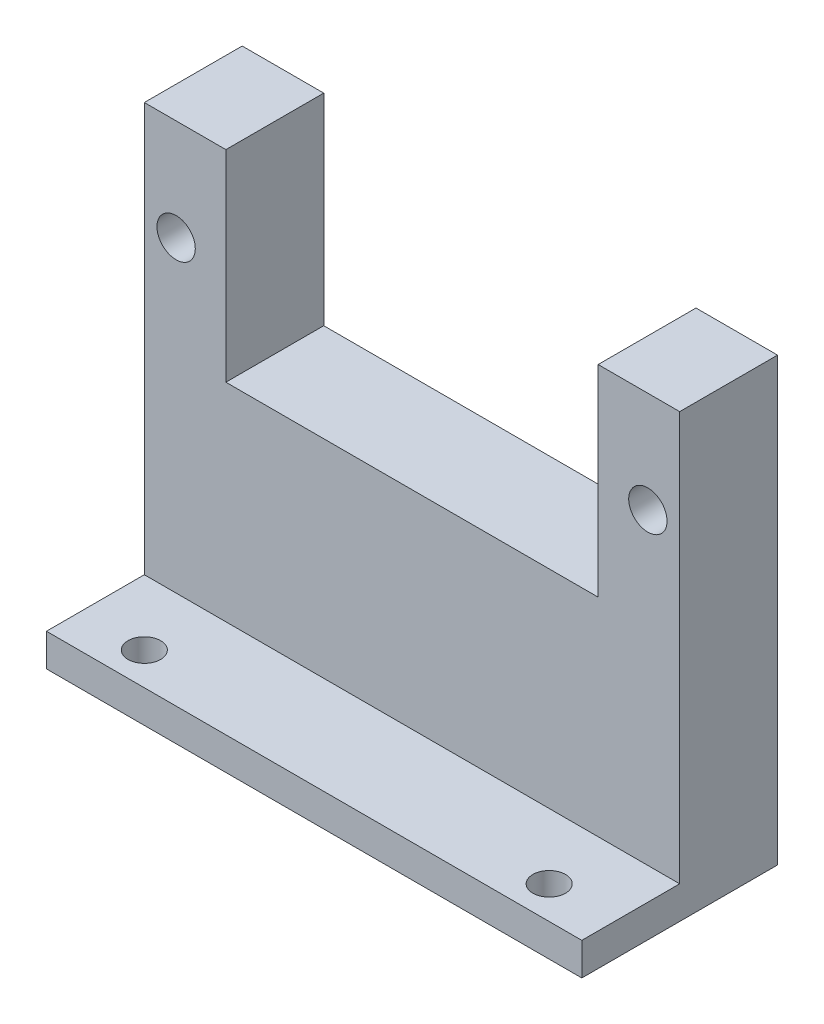
ISO-10303-21;
HEADER;
FILE_DESCRIPTION(('STEP AP214'),'2;1');
FILE_NAME('part.step','',(''),(''),'','','');
FILE_SCHEMA(('AUTOMOTIVE_DESIGN { 1 0 10303 214 1 1 1 1 }'));
ENDSEC;
DATA;
#1=APPLICATION_CONTEXT('core data for automotive mechanical design processes');
#2=APPLICATION_PROTOCOL_DEFINITION('international standard','automotive_design',2000,#1);
#3=PRODUCT_CONTEXT('',#1,'mechanical');
#4=PRODUCT('Part','Part','',(#3));
#5=PRODUCT_RELATED_PRODUCT_CATEGORY('part','',(#4));
#6=PRODUCT_DEFINITION_FORMATION('','',#4);
#7=PRODUCT_DEFINITION_CONTEXT('part definition',#1,'design');
#8=PRODUCT_DEFINITION('design','',#6,#7);
#9=PRODUCT_DEFINITION_SHAPE('','',#8);
#10=(LENGTH_UNIT() NAMED_UNIT(*) SI_UNIT(.MILLI.,.METRE.));
#11=(NAMED_UNIT(*) PLANE_ANGLE_UNIT() SI_UNIT($,.RADIAN.));
#12=(NAMED_UNIT(*) SI_UNIT($,.STERADIAN.) SOLID_ANGLE_UNIT());
#13=UNCERTAINTY_MEASURE_WITH_UNIT(LENGTH_MEASURE(1.E-05),#10,'distance_accuracy_value','');
#14=(GEOMETRIC_REPRESENTATION_CONTEXT(3) GLOBAL_UNCERTAINTY_ASSIGNED_CONTEXT((#13)) GLOBAL_UNIT_ASSIGNED_CONTEXT((#10,
#11,#12)) REPRESENTATION_CONTEXT('',''));
#15=CARTESIAN_POINT('',(0.,0.,0.));
#16=DIRECTION('',(0.,0.,1.));
#17=DIRECTION('',(1.,0.,0.));
#18=AXIS2_PLACEMENT_3D('',#15,#16,#17);
#19=CARTESIAN_POINT('',(0.,27.07,12.));
#20=DIRECTION('',(0.,1.,0.));
#21=DIRECTION('',(0.,0.,1.));
#22=AXIS2_PLACEMENT_3D('',#19,#20,#21);
#23=PLANE('',#22);
#24=DIRECTION('',(0.,0.,-1.));
#25=VECTOR('',#24,1.);
#26=CARTESIAN_POINT('',(5.,27.07,12.));
#27=LINE('',#26,#25);
#28=CARTESIAN_POINT('',(5.,27.07,6.));
#29=VERTEX_POINT('',#28);
#30=CARTESIAN_POINT('',(5.,27.07,0.));
#31=VERTEX_POINT('',#30);
#32=EDGE_CURVE('E116',#29,#31,#27,.T.);
#33=ORIENTED_EDGE('',*,*,#32,.T.);
#34=DIRECTION('',(1.,0.,0.));
#35=VECTOR('',#34,1.);
#36=CARTESIAN_POINT('',(0.,27.07,0.));
#37=LINE('',#36,#35);
#38=CARTESIAN_POINT('',(0.,27.07,0.));
#39=VERTEX_POINT('',#38);
#40=EDGE_CURVE('E130',#39,#31,#37,.T.);
#41=ORIENTED_EDGE('',*,*,#40,.F.);
#42=DIRECTION('',(0.,0.,-1.));
#43=VECTOR('',#42,1.);
#44=CARTESIAN_POINT('',(0.,27.07,12.));
#45=LINE('',#44,#43);
#46=CARTESIAN_POINT('',(0.,27.07,6.));
#47=VERTEX_POINT('',#46);
#48=EDGE_CURVE('E152',#47,#39,#45,.T.);
#49=ORIENTED_EDGE('',*,*,#48,.F.);
#50=DIRECTION('',(-1.,0.,0.));
#51=VECTOR('',#50,1.);
#52=CARTESIAN_POINT('',(32.82,27.07,6.));
#53=LINE('',#52,#51);
#54=EDGE_CURVE('E131',#29,#47,#53,.T.);
#55=ORIENTED_EDGE('',*,*,#54,.F.);
#56=EDGE_LOOP('',(#33,#41,#49,#55));
#57=FACE_BOUND('',#56,.T.);
#58=ADVANCED_FACE('F37',(#57),#23,.T.);
#59=CARTESIAN_POINT('',(32.82,27.07,12.));
#60=DIRECTION('',(1.,0.,0.));
#61=DIRECTION('',(0.,0.,-1.));
#62=AXIS2_PLACEMENT_3D('',#59,#60,#61);
#63=PLANE('',#62);
#64=DIRECTION('',(0.,0.,1.));
#65=VECTOR('',#64,1.);
#66=CARTESIAN_POINT('',(32.82,2.,6.));
#67=LINE('',#66,#65);
#68=CARTESIAN_POINT('',(32.82,2.,6.));
#69=VERTEX_POINT('',#68);
#70=CARTESIAN_POINT('',(32.82,2.,12.));
#71=VERTEX_POINT('',#70);
#72=EDGE_CURVE('E178',#69,#71,#67,.T.);
#73=ORIENTED_EDGE('',*,*,#72,.T.);
#74=DIRECTION('',(0.,-1.,0.));
#75=VECTOR('',#74,1.);
#76=CARTESIAN_POINT('',(32.82,27.07,12.));
#77=LINE('',#76,#75);
#78=CARTESIAN_POINT('',(32.82,0.,12.));
#79=VERTEX_POINT('',#78);
#80=EDGE_CURVE('E140',#71,#79,#77,.T.);
#81=ORIENTED_EDGE('',*,*,#80,.T.);
#82=DIRECTION('',(0.,0.,-1.));
#83=VECTOR('',#82,1.);
#84=CARTESIAN_POINT('',(32.82,0.,12.));
#85=LINE('',#84,#83);
#86=CARTESIAN_POINT('',(32.82,0.,0.));
#87=VERTEX_POINT('',#86);
#88=EDGE_CURVE('E156',#79,#87,#85,.T.);
#89=ORIENTED_EDGE('',*,*,#88,.T.);
#90=DIRECTION('',(0.,-1.,0.));
#91=VECTOR('',#90,1.);
#92=CARTESIAN_POINT('',(32.82,27.07,0.));
#93=LINE('',#92,#91);
#94=CARTESIAN_POINT('',(32.82,27.07,0.));
#95=VERTEX_POINT('',#94);
#96=EDGE_CURVE('E184',#95,#87,#93,.T.);
#97=ORIENTED_EDGE('',*,*,#96,.F.);
#98=DIRECTION('',(0.,0.,-1.));
#99=VECTOR('',#98,1.);
#100=CARTESIAN_POINT('',(32.82,27.07,12.));
#101=LINE('',#100,#99);
#102=CARTESIAN_POINT('',(32.82,27.07,6.));
#103=VERTEX_POINT('',#102);
#104=EDGE_CURVE('E148',#103,#95,#101,.T.);
#105=ORIENTED_EDGE('',*,*,#104,.F.);
#106=DIRECTION('',(0.,-1.,0.));
#107=VECTOR('',#106,1.);
#108=CARTESIAN_POINT('',(32.82,27.07,6.));
#109=LINE('',#108,#107);
#110=EDGE_CURVE('E175',#103,#69,#109,.T.);
#111=ORIENTED_EDGE('',*,*,#110,.T.);
#112=EDGE_LOOP('',(#73,#81,#89,#97,#105,#111));
#113=FACE_BOUND('',#112,.T.);
#114=ADVANCED_FACE('F39',(#113),#63,.T.);
#115=DIRECTION('',(0.,0.,-1.));
#116=VECTOR('',#115,1.);
#117=CARTESIAN_POINT('',(27.82,27.07,12.));
#118=LINE('',#117,#116);
#119=CARTESIAN_POINT('',(27.82,27.07,6.));
#120=VERTEX_POINT('',#119);
#121=CARTESIAN_POINT('',(27.82,27.07,0.));
#122=VERTEX_POINT('',#121);
#123=EDGE_CURVE('E132',#120,#122,#118,.T.);
#124=ORIENTED_EDGE('',*,*,#123,.F.);
#125=EDGE_CURVE('E187',#103,#120,#53,.T.);
#126=ORIENTED_EDGE('',*,*,#125,.F.);
#127=ORIENTED_EDGE('',*,*,#104,.T.);
#128=EDGE_CURVE('E141',#122,#95,#37,.T.);
#129=ORIENTED_EDGE('',*,*,#128,.F.);
#130=EDGE_LOOP('',(#124,#126,#127,#129));
#131=FACE_BOUND('',#130,.T.);
#132=ADVANCED_FACE('F214',(#131),#23,.T.);
#133=CARTESIAN_POINT('',(0.,0.,12.));
#134=DIRECTION('',(-1.,0.,0.));
#135=DIRECTION('',(0.,0.,1.));
#136=AXIS2_PLACEMENT_3D('',#133,#134,#135);
#137=PLANE('',#136);
#138=DIRECTION('',(0.,0.,1.));
#139=VECTOR('',#138,1.);
#140=CARTESIAN_POINT('',(0.,2.,6.));
#141=LINE('',#140,#139);
#142=CARTESIAN_POINT('',(0.,2.,6.));
#143=VERTEX_POINT('',#142);
#144=CARTESIAN_POINT('',(0.,2.,12.));
#145=VERTEX_POINT('',#144);
#146=EDGE_CURVE('E60',#143,#145,#141,.T.);
#147=ORIENTED_EDGE('',*,*,#146,.F.);
#148=DIRECTION('',(0.,-1.,0.));
#149=VECTOR('',#148,1.);
#150=CARTESIAN_POINT('',(0.,27.07,6.));
#151=LINE('',#150,#149);
#152=EDGE_CURVE('E166',#47,#143,#151,.T.);
#153=ORIENTED_EDGE('',*,*,#152,.F.);
#154=ORIENTED_EDGE('',*,*,#48,.T.);
#155=DIRECTION('',(0.,1.,0.));
#156=VECTOR('',#155,1.);
#157=CARTESIAN_POINT('',(0.,0.,0.));
#158=LINE('',#157,#156);
#159=CARTESIAN_POINT('',(0.,0.,0.));
#160=VERTEX_POINT('',#159);
#161=EDGE_CURVE('E139',#160,#39,#158,.T.);
#162=ORIENTED_EDGE('',*,*,#161,.F.);
#163=DIRECTION('',(0.,0.,-1.));
#164=VECTOR('',#163,1.);
#165=CARTESIAN_POINT('',(0.,0.,12.));
#166=LINE('',#165,#164);
#167=CARTESIAN_POINT('',(0.,0.,12.));
#168=VERTEX_POINT('',#167);
#169=EDGE_CURVE('E154',#168,#160,#166,.T.);
#170=ORIENTED_EDGE('',*,*,#169,.F.);
#171=DIRECTION('',(0.,1.,0.));
#172=VECTOR('',#171,1.);
#173=CARTESIAN_POINT('',(0.,0.,12.));
#174=LINE('',#173,#172);
#175=EDGE_CURVE('E158',#168,#145,#174,.T.);
#176=ORIENTED_EDGE('',*,*,#175,.T.);
#177=EDGE_LOOP('',(#147,#153,#154,#162,#170,#176));
#178=FACE_BOUND('',#177,.T.);
#179=ADVANCED_FACE('F203',(#178),#137,.T.);
#180=CARTESIAN_POINT('',(32.82,0.,12.));
#181=DIRECTION('',(0.,-1.,0.));
#182=DIRECTION('',(1.,0.,0.));
#183=AXIS2_PLACEMENT_3D('',#180,#181,#182);
#184=PLANE('',#183);
#185=CARTESIAN_POINT('',(28.82,0.,10.));
#186=DIRECTION('',(0.,1.,0.));
#187=DIRECTION('',(0.,0.,1.));
#188=AXIS2_PLACEMENT_3D('',#185,#186,#187);
#189=CIRCLE('',#188,0.999999999999987);
#190=CARTESIAN_POINT('',(28.82,0.,11.));
#191=VERTEX_POINT('',#190);
#192=EDGE_CURVE('E235',#191,#191,#189,.T.);
#193=ORIENTED_EDGE('',*,*,#192,.T.);
#194=EDGE_LOOP('',(#193));
#195=FACE_BOUND('',#194,.T.);
#196=CARTESIAN_POINT('',(4.,0.,10.));
#197=DIRECTION('',(0.,1.,0.));
#198=DIRECTION('',(0.,0.,1.));
#199=AXIS2_PLACEMENT_3D('',#196,#197,#198);
#200=CIRCLE('',#199,0.999999999999986);
#201=CARTESIAN_POINT('',(4.,0.,11.));
#202=VERTEX_POINT('',#201);
#203=EDGE_CURVE('E229',#202,#202,#200,.T.);
#204=ORIENTED_EDGE('',*,*,#203,.T.);
#205=EDGE_LOOP('',(#204));
#206=FACE_BOUND('',#205,.T.);
#207=DIRECTION('',(-1.,0.,0.));
#208=VECTOR('',#207,1.);
#209=CARTESIAN_POINT('',(32.82,0.,0.));
#210=LINE('',#209,#208);
#211=EDGE_CURVE('E194',#87,#160,#210,.T.);
#212=ORIENTED_EDGE('',*,*,#211,.F.);
#213=ORIENTED_EDGE('',*,*,#88,.F.);
#214=DIRECTION('',(-1.,0.,0.));
#215=VECTOR('',#214,1.);
#216=CARTESIAN_POINT('',(32.82,0.,12.));
#217=LINE('',#216,#215);
#218=EDGE_CURVE('E143',#79,#168,#217,.T.);
#219=ORIENTED_EDGE('',*,*,#218,.T.);
#220=ORIENTED_EDGE('',*,*,#169,.T.);
#221=EDGE_LOOP('',(#212,#213,#219,#220));
#222=FACE_BOUND('',#221,.T.);
#223=ADVANCED_FACE('F199',(#195,#206,#222),#184,.T.);
#224=CARTESIAN_POINT('',(0.,0.,12.));
#225=DIRECTION('',(0.,0.,-1.));
#226=DIRECTION('',(-1.,0.,0.));
#227=AXIS2_PLACEMENT_3D('',#224,#225,#226);
#228=PLANE('',#227);
#229=ORIENTED_EDGE('',*,*,#80,.F.);
#230=DIRECTION('',(-1.,0.,0.));
#231=VECTOR('',#230,1.);
#232=CARTESIAN_POINT('',(32.82,2.,12.));
#233=LINE('',#232,#231);
#234=EDGE_CURVE('E182',#71,#145,#233,.T.);
#235=ORIENTED_EDGE('',*,*,#234,.T.);
#236=ORIENTED_EDGE('',*,*,#175,.F.);
#237=ORIENTED_EDGE('',*,*,#218,.F.);
#238=EDGE_LOOP('',(#229,#235,#236,#237));
#239=FACE_BOUND('',#238,.T.);
#240=ADVANCED_FACE('F278',(#239),#228,.F.);
#241=CARTESIAN_POINT('',(0.,0.,0.));
#242=DIRECTION('',(0.,0.,-1.));
#243=DIRECTION('',(-1.,0.,0.));
#244=AXIS2_PLACEMENT_3D('',#241,#242,#243);
#245=PLANE('',#244);
#246=CARTESIAN_POINT('',(1.95,20.87,0.));
#247=DIRECTION('',(0.,0.,1.));
#248=DIRECTION('',(1.,0.,0.));
#249=AXIS2_PLACEMENT_3D('',#246,#247,#248);
#250=CIRCLE('',#249,1.17499999999999);
#251=CARTESIAN_POINT('',(3.12499999999999,20.87,0.));
#252=VERTEX_POINT('',#251);
#253=EDGE_CURVE('E223',#252,#252,#250,.T.);
#254=ORIENTED_EDGE('',*,*,#253,.T.);
#255=EDGE_LOOP('',(#254));
#256=FACE_BOUND('',#255,.T.);
#257=CARTESIAN_POINT('',(30.87,20.87,0.));
#258=DIRECTION('',(0.,0.,1.));
#259=DIRECTION('',(1.,0.,0.));
#260=AXIS2_PLACEMENT_3D('',#257,#258,#259);
#261=CIRCLE('',#260,1.17499999999999);
#262=CARTESIAN_POINT('',(32.045,20.87,0.));
#263=VERTEX_POINT('',#262);
#264=EDGE_CURVE('E124',#263,#263,#261,.T.);
#265=ORIENTED_EDGE('',*,*,#264,.T.);
#266=EDGE_LOOP('',(#265));
#267=FACE_BOUND('',#266,.T.);
#268=DIRECTION('',(0.,1.,0.));
#269=VECTOR('',#268,1.);
#270=CARTESIAN_POINT('',(5.,14.72,0.));
#271=LINE('',#270,#269);
#272=CARTESIAN_POINT('',(5.,14.72,0.));
#273=VERTEX_POINT('',#272);
#274=EDGE_CURVE('E113',#273,#31,#271,.T.);
#275=ORIENTED_EDGE('',*,*,#274,.F.);
#276=DIRECTION('',(-1.,0.,0.));
#277=VECTOR('',#276,1.);
#278=CARTESIAN_POINT('',(27.82,14.72,0.));
#279=LINE('',#278,#277);
#280=CARTESIAN_POINT('',(27.82,14.72,0.));
#281=VERTEX_POINT('',#280);
#282=EDGE_CURVE('E133',#281,#273,#279,.T.);
#283=ORIENTED_EDGE('',*,*,#282,.F.);
#284=DIRECTION('',(0.,-1.,0.));
#285=VECTOR('',#284,1.);
#286=CARTESIAN_POINT('',(27.82,27.07,0.));
#287=LINE('',#286,#285);
#288=EDGE_CURVE('E123',#122,#281,#287,.T.);
#289=ORIENTED_EDGE('',*,*,#288,.F.);
#290=ORIENTED_EDGE('',*,*,#128,.T.);
#291=ORIENTED_EDGE('',*,*,#96,.T.);
#292=ORIENTED_EDGE('',*,*,#211,.T.);
#293=ORIENTED_EDGE('',*,*,#161,.T.);
#294=ORIENTED_EDGE('',*,*,#40,.T.);
#295=EDGE_LOOP('',(#275,#283,#289,#290,#291,#292,#293,#294));
#296=FACE_BOUND('',#295,.T.);
#297=ADVANCED_FACE('F136',(#256,#267,#296),#245,.T.);
#298=CARTESIAN_POINT('',(32.82,2.,6.));
#299=DIRECTION('',(0.,-1.,0.));
#300=DIRECTION('',(0.,0.,-1.));
#301=AXIS2_PLACEMENT_3D('',#298,#299,#300);
#302=PLANE('',#301);
#303=CARTESIAN_POINT('',(28.82,2.,10.));
#304=DIRECTION('',(0.,1.,0.));
#305=DIRECTION('',(0.,0.,1.));
#306=AXIS2_PLACEMENT_3D('',#303,#304,#305);
#307=CIRCLE('',#306,0.999999999999987);
#308=CARTESIAN_POINT('',(28.82,2.,11.));
#309=VERTEX_POINT('',#308);
#310=EDGE_CURVE('E238',#309,#309,#307,.T.);
#311=ORIENTED_EDGE('',*,*,#310,.F.);
#312=EDGE_LOOP('',(#311));
#313=FACE_BOUND('',#312,.T.);
#314=CARTESIAN_POINT('',(4.,2.,10.));
#315=DIRECTION('',(0.,1.,0.));
#316=DIRECTION('',(0.,0.,1.));
#317=AXIS2_PLACEMENT_3D('',#314,#315,#316);
#318=CIRCLE('',#317,0.999999999999987);
#319=CARTESIAN_POINT('',(4.,2.,11.));
#320=VERTEX_POINT('',#319);
#321=EDGE_CURVE('E232',#320,#320,#318,.T.);
#322=ORIENTED_EDGE('',*,*,#321,.F.);
#323=EDGE_LOOP('',(#322));
#324=FACE_BOUND('',#323,.T.);
#325=ORIENTED_EDGE('',*,*,#146,.T.);
#326=ORIENTED_EDGE('',*,*,#234,.F.);
#327=ORIENTED_EDGE('',*,*,#72,.F.);
#328=DIRECTION('',(-1.,0.,0.));
#329=VECTOR('',#328,1.);
#330=CARTESIAN_POINT('',(32.82,2.,6.));
#331=LINE('',#330,#329);
#332=EDGE_CURVE('E185',#69,#143,#331,.T.);
#333=ORIENTED_EDGE('',*,*,#332,.T.);
#334=EDGE_LOOP('',(#325,#326,#327,#333));
#335=FACE_BOUND('',#334,.T.);
#336=ADVANCED_FACE('F207',(#313,#324,#335),#302,.F.);
#337=CARTESIAN_POINT('',(32.82,27.07,6.));
#338=DIRECTION('',(0.,0.,-1.));
#339=DIRECTION('',(-1.,0.,0.));
#340=AXIS2_PLACEMENT_3D('',#337,#338,#339);
#341=PLANE('',#340);
#342=CARTESIAN_POINT('',(1.95,20.87,6.));
#343=DIRECTION('',(0.,0.,1.));
#344=DIRECTION('',(1.,0.,0.));
#345=AXIS2_PLACEMENT_3D('',#342,#343,#344);
#346=CIRCLE('',#345,1.17499999999999);
#347=CARTESIAN_POINT('',(3.12499999999999,20.87,6.));
#348=VERTEX_POINT('',#347);
#349=EDGE_CURVE('E226',#348,#348,#346,.T.);
#350=ORIENTED_EDGE('',*,*,#349,.F.);
#351=EDGE_LOOP('',(#350));
#352=FACE_BOUND('',#351,.T.);
#353=CARTESIAN_POINT('',(30.87,20.87,6.));
#354=DIRECTION('',(0.,0.,1.));
#355=DIRECTION('',(1.,0.,0.));
#356=AXIS2_PLACEMENT_3D('',#353,#354,#355);
#357=CIRCLE('',#356,1.17499999999999);
#358=CARTESIAN_POINT('',(32.045,20.87,6.));
#359=VERTEX_POINT('',#358);
#360=EDGE_CURVE('E220',#359,#359,#357,.T.);
#361=ORIENTED_EDGE('',*,*,#360,.F.);
#362=EDGE_LOOP('',(#361));
#363=FACE_BOUND('',#362,.T.);
#364=DIRECTION('',(-1.,0.,0.));
#365=VECTOR('',#364,1.);
#366=CARTESIAN_POINT('',(32.82,14.72,6.));
#367=LINE('',#366,#365);
#368=CARTESIAN_POINT('',(27.82,14.72,6.));
#369=VERTEX_POINT('',#368);
#370=CARTESIAN_POINT('',(5.,14.72,6.));
#371=VERTEX_POINT('',#370);
#372=EDGE_CURVE('E45',#369,#371,#367,.T.);
#373=ORIENTED_EDGE('',*,*,#372,.T.);
#374=DIRECTION('',(0.,1.,0.));
#375=VECTOR('',#374,1.);
#376=CARTESIAN_POINT('',(5.,27.07,6.));
#377=LINE('',#376,#375);
#378=EDGE_CURVE('E11',#371,#29,#377,.T.);
#379=ORIENTED_EDGE('',*,*,#378,.T.);
#380=ORIENTED_EDGE('',*,*,#54,.T.);
#381=ORIENTED_EDGE('',*,*,#152,.T.);
#382=ORIENTED_EDGE('',*,*,#332,.F.);
#383=ORIENTED_EDGE('',*,*,#110,.F.);
#384=ORIENTED_EDGE('',*,*,#125,.T.);
#385=DIRECTION('',(0.,-1.,0.));
#386=VECTOR('',#385,1.);
#387=CARTESIAN_POINT('',(27.82,27.07,6.));
#388=LINE('',#387,#386);
#389=EDGE_CURVE('E151',#120,#369,#388,.T.);
#390=ORIENTED_EDGE('',*,*,#389,.T.);
#391=EDGE_LOOP('',(#373,#379,#380,#381,#382,#383,#384,#390));
#392=FACE_BOUND('',#391,.T.);
#393=ADVANCED_FACE('F162',(#352,#363,#392),#341,.F.);
#394=CARTESIAN_POINT('',(5.,14.72,12.));
#395=DIRECTION('',(-1.,0.,0.));
#396=DIRECTION('',(0.,0.,1.));
#397=AXIS2_PLACEMENT_3D('',#394,#395,#396);
#398=PLANE('',#397);
#399=DIRECTION('',(0.,0.,-1.));
#400=VECTOR('',#399,1.);
#401=CARTESIAN_POINT('',(5.,14.72,12.));
#402=LINE('',#401,#400);
#403=EDGE_CURVE('E118',#371,#273,#402,.T.);
#404=ORIENTED_EDGE('',*,*,#403,.T.);
#405=ORIENTED_EDGE('',*,*,#274,.T.);
#406=ORIENTED_EDGE('',*,*,#32,.F.);
#407=ORIENTED_EDGE('',*,*,#378,.F.);
#408=EDGE_LOOP('',(#404,#405,#406,#407));
#409=FACE_BOUND('',#408,.T.);
#410=ADVANCED_FACE('F115',(#409),#398,.F.);
#411=CARTESIAN_POINT('',(27.82,14.72,12.));
#412=DIRECTION('',(0.,-1.,0.));
#413=DIRECTION('',(0.,0.,-1.));
#414=AXIS2_PLACEMENT_3D('',#411,#412,#413);
#415=PLANE('',#414);
#416=DIRECTION('',(0.,0.,-1.));
#417=VECTOR('',#416,1.);
#418=CARTESIAN_POINT('',(27.82,14.72,12.));
#419=LINE('',#418,#417);
#420=EDGE_CURVE('E52',#369,#281,#419,.T.);
#421=ORIENTED_EDGE('',*,*,#420,.T.);
#422=ORIENTED_EDGE('',*,*,#282,.T.);
#423=ORIENTED_EDGE('',*,*,#403,.F.);
#424=ORIENTED_EDGE('',*,*,#372,.F.);
#425=EDGE_LOOP('',(#421,#422,#423,#424));
#426=FACE_BOUND('',#425,.T.);
#427=ADVANCED_FACE('F165',(#426),#415,.F.);
#428=CARTESIAN_POINT('',(27.82,27.07,12.));
#429=DIRECTION('',(1.,0.,0.));
#430=DIRECTION('',(0.,0.,-1.));
#431=AXIS2_PLACEMENT_3D('',#428,#429,#430);
#432=PLANE('',#431);
#433=ORIENTED_EDGE('',*,*,#123,.T.);
#434=ORIENTED_EDGE('',*,*,#288,.T.);
#435=ORIENTED_EDGE('',*,*,#420,.F.);
#436=ORIENTED_EDGE('',*,*,#389,.F.);
#437=EDGE_LOOP('',(#433,#434,#435,#436));
#438=FACE_BOUND('',#437,.T.);
#439=ADVANCED_FACE('F216',(#438),#432,.F.);
#440=CARTESIAN_POINT('',(30.87,20.87,6.));
#441=DIRECTION('',(0.,0.,1.));
#442=DIRECTION('',(1.,0.,0.));
#443=AXIS2_PLACEMENT_3D('',#440,#441,#442);
#444=CYLINDRICAL_SURFACE('',#443,1.17499999999999);
#445=ORIENTED_EDGE('',*,*,#264,.F.);
#446=EDGE_LOOP('',(#445));
#447=FACE_BOUND('',#446,.T.);
#448=ORIENTED_EDGE('',*,*,#360,.T.);
#449=EDGE_LOOP('',(#448));
#450=FACE_BOUND('',#449,.T.);
#451=ADVANCED_FACE('F260',(#447,#450),#444,.F.);
#452=CARTESIAN_POINT('',(1.95,20.87,6.));
#453=DIRECTION('',(0.,0.,1.));
#454=DIRECTION('',(1.,0.,0.));
#455=AXIS2_PLACEMENT_3D('',#452,#453,#454);
#456=CYLINDRICAL_SURFACE('',#455,1.17499999999999);
#457=ORIENTED_EDGE('',*,*,#253,.F.);
#458=EDGE_LOOP('',(#457));
#459=FACE_BOUND('',#458,.T.);
#460=ORIENTED_EDGE('',*,*,#349,.T.);
#461=EDGE_LOOP('',(#460));
#462=FACE_BOUND('',#461,.T.);
#463=ADVANCED_FACE('F251',(#459,#462),#456,.F.);
#464=CARTESIAN_POINT('',(4.,2.,10.));
#465=DIRECTION('',(0.,1.,0.));
#466=DIRECTION('',(0.,0.,1.));
#467=AXIS2_PLACEMENT_3D('',#464,#465,#466);
#468=CYLINDRICAL_SURFACE('',#467,0.999999999999987);
#469=ORIENTED_EDGE('',*,*,#203,.F.);
#470=EDGE_LOOP('',(#469));
#471=FACE_BOUND('',#470,.T.);
#472=ORIENTED_EDGE('',*,*,#321,.T.);
#473=EDGE_LOOP('',(#472));
#474=FACE_BOUND('',#473,.T.);
#475=ADVANCED_FACE('F249',(#471,#474),#468,.F.);
#476=CARTESIAN_POINT('',(28.82,2.,10.));
#477=DIRECTION('',(0.,1.,0.));
#478=DIRECTION('',(0.,0.,1.));
#479=AXIS2_PLACEMENT_3D('',#476,#477,#478);
#480=CYLINDRICAL_SURFACE('',#479,0.999999999999987);
#481=ORIENTED_EDGE('',*,*,#192,.F.);
#482=EDGE_LOOP('',(#481));
#483=FACE_BOUND('',#482,.T.);
#484=ORIENTED_EDGE('',*,*,#310,.T.);
#485=EDGE_LOOP('',(#484));
#486=FACE_BOUND('',#485,.T.);
#487=ADVANCED_FACE('F242',(#483,#486),#480,.F.);
#488=CLOSED_SHELL('',(#58,#114,#132,#179,#223,#240,#297,#336,#393,#410,#427,#439,#451,#463,#475,#487));
#489=MANIFOLD_SOLID_BREP('B2',#488);
#490=ADVANCED_BREP_SHAPE_REPRESENTATION('',(#18,#489),#14);
#491=SHAPE_DEFINITION_REPRESENTATION(#9,#490);
ENDSEC;
END-ISO-10303-21;
